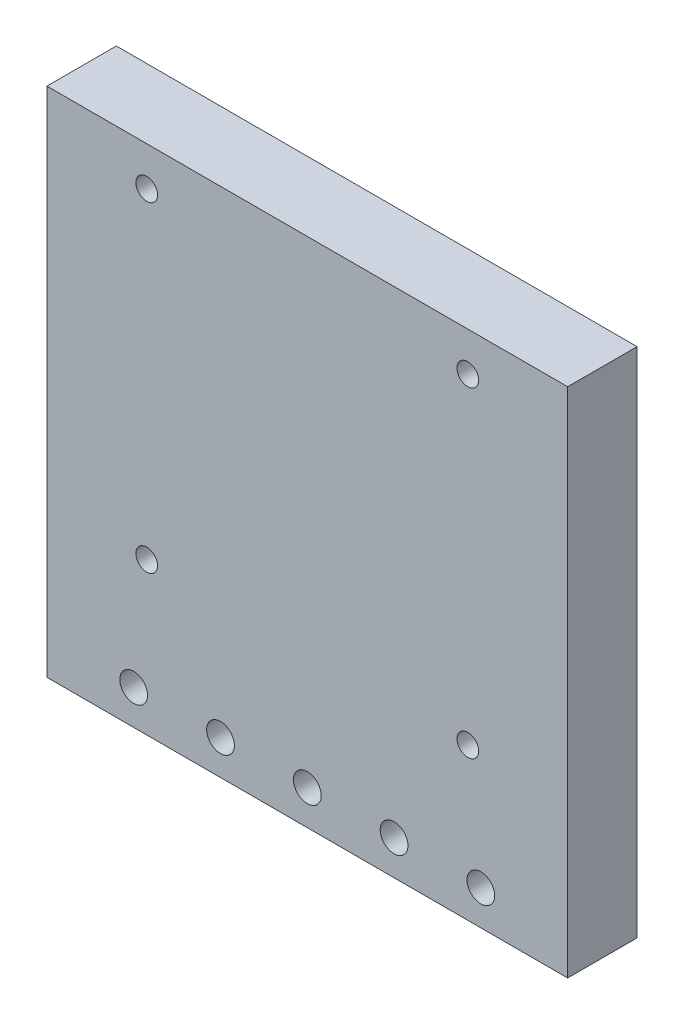
ISO-10303-21;
HEADER;
FILE_DESCRIPTION(('STEP AP214'),'2;1');
FILE_NAME('part.step','',(''),(''),'','','');
FILE_SCHEMA(('AUTOMOTIVE_DESIGN { 1 0 10303 214 1 1 1 1 }'));
ENDSEC;
DATA;
#1=APPLICATION_CONTEXT('core data for automotive mechanical design processes');
#2=APPLICATION_PROTOCOL_DEFINITION('international standard','automotive_design',2000,#1);
#3=PRODUCT_CONTEXT('',#1,'mechanical');
#4=PRODUCT('Part','Part','',(#3));
#5=PRODUCT_RELATED_PRODUCT_CATEGORY('part','',(#4));
#6=PRODUCT_DEFINITION_FORMATION('','',#4);
#7=PRODUCT_DEFINITION_CONTEXT('part definition',#1,'design');
#8=PRODUCT_DEFINITION('design','',#6,#7);
#9=PRODUCT_DEFINITION_SHAPE('','',#8);
#10=(LENGTH_UNIT() NAMED_UNIT(*) SI_UNIT(.MILLI.,.METRE.));
#11=(NAMED_UNIT(*) PLANE_ANGLE_UNIT() SI_UNIT($,.RADIAN.));
#12=(NAMED_UNIT(*) SI_UNIT($,.STERADIAN.) SOLID_ANGLE_UNIT());
#13=UNCERTAINTY_MEASURE_WITH_UNIT(LENGTH_MEASURE(1.E-05),#10,'distance_accuracy_value','');
#14=(GEOMETRIC_REPRESENTATION_CONTEXT(3) GLOBAL_UNCERTAINTY_ASSIGNED_CONTEXT((#13)) GLOBAL_UNIT_ASSIGNED_CONTEXT((#10,
#11,#12)) REPRESENTATION_CONTEXT('',''));
#15=CARTESIAN_POINT('',(0.,0.,0.));
#16=DIRECTION('',(0.,0.,1.));
#17=DIRECTION('',(1.,0.,0.));
#18=AXIS2_PLACEMENT_3D('',#15,#16,#17);
#19=CARTESIAN_POINT('',(0.,0.,8.));
#20=DIRECTION('',(1.,0.,0.));
#21=DIRECTION('',(0.,1.,0.));
#22=AXIS2_PLACEMENT_3D('',#19,#20,#21);
#23=PLANE('',#22);
#24=DIRECTION('',(0.,-1.,0.));
#25=VECTOR('',#24,1.);
#26=CARTESIAN_POINT('',(0.,0.,0.));
#27=LINE('',#26,#25);
#28=CARTESIAN_POINT('',(0.,0.,0.));
#29=VERTEX_POINT('',#28);
#30=CARTESIAN_POINT('',(0.,-59.,0.));
#31=VERTEX_POINT('',#30);
#32=EDGE_CURVE('E104',#29,#31,#27,.T.);
#33=ORIENTED_EDGE('',*,*,#32,.T.);
#34=DIRECTION('',(0.,0.,-1.));
#35=VECTOR('',#34,1.);
#36=CARTESIAN_POINT('',(0.,-59.,8.));
#37=LINE('',#36,#35);
#38=CARTESIAN_POINT('',(0.,-59.,8.));
#39=VERTEX_POINT('',#38);
#40=EDGE_CURVE('E11',#39,#31,#37,.T.);
#41=ORIENTED_EDGE('',*,*,#40,.F.);
#42=DIRECTION('',(0.,-1.,0.));
#43=VECTOR('',#42,1.);
#44=CARTESIAN_POINT('',(0.,0.,8.));
#45=LINE('',#44,#43);
#46=CARTESIAN_POINT('',(0.,0.,8.));
#47=VERTEX_POINT('',#46);
#48=EDGE_CURVE('E92',#47,#39,#45,.T.);
#49=ORIENTED_EDGE('',*,*,#48,.F.);
#50=DIRECTION('',(0.,0.,-1.));
#51=VECTOR('',#50,1.);
#52=CARTESIAN_POINT('',(0.,0.,8.));
#53=LINE('',#52,#51);
#54=EDGE_CURVE('E100',#47,#29,#53,.T.);
#55=ORIENTED_EDGE('',*,*,#54,.T.);
#56=EDGE_LOOP('',(#33,#41,#49,#55));
#57=FACE_BOUND('',#56,.T.);
#58=ADVANCED_FACE('F41',(#57),#23,.F.);
#59=CARTESIAN_POINT('',(0.,-59.,8.));
#60=DIRECTION('',(0.,1.,0.));
#61=DIRECTION('',(0.,0.,1.));
#62=AXIS2_PLACEMENT_3D('',#59,#60,#61);
#63=PLANE('',#62);
#64=DIRECTION('',(1.,0.,0.));
#65=VECTOR('',#64,1.);
#66=CARTESIAN_POINT('',(0.,-59.,0.));
#67=LINE('',#66,#65);
#68=CARTESIAN_POINT('',(60.,-59.,0.));
#69=VERTEX_POINT('',#68);
#70=EDGE_CURVE('E96',#31,#69,#67,.T.);
#71=ORIENTED_EDGE('',*,*,#70,.T.);
#72=DIRECTION('',(0.,0.,-1.));
#73=VECTOR('',#72,1.);
#74=CARTESIAN_POINT('',(60.,-59.,8.));
#75=LINE('',#74,#73);
#76=CARTESIAN_POINT('',(60.,-59.,8.));
#77=VERTEX_POINT('',#76);
#78=EDGE_CURVE('E49',#77,#69,#75,.T.);
#79=ORIENTED_EDGE('',*,*,#78,.F.);
#80=DIRECTION('',(1.,0.,0.));
#81=VECTOR('',#80,1.);
#82=CARTESIAN_POINT('',(0.,-59.,8.));
#83=LINE('',#82,#81);
#84=EDGE_CURVE('E87',#39,#77,#83,.T.);
#85=ORIENTED_EDGE('',*,*,#84,.F.);
#86=ORIENTED_EDGE('',*,*,#40,.T.);
#87=EDGE_LOOP('',(#71,#79,#85,#86));
#88=FACE_BOUND('',#87,.T.);
#89=ADVANCED_FACE('F95',(#88),#63,.F.);
#90=CARTESIAN_POINT('',(60.,0.,8.));
#91=DIRECTION('',(-1.,0.,0.));
#92=DIRECTION('',(0.,-1.,0.));
#93=AXIS2_PLACEMENT_3D('',#90,#91,#92);
#94=PLANE('',#93);
#95=DIRECTION('',(0.,1.,0.));
#96=VECTOR('',#95,1.);
#97=CARTESIAN_POINT('',(60.,0.,0.));
#98=LINE('',#97,#96);
#99=CARTESIAN_POINT('',(60.,0.,0.));
#100=VERTEX_POINT('',#99);
#101=EDGE_CURVE('E74',#69,#100,#98,.T.);
#102=ORIENTED_EDGE('',*,*,#101,.T.);
#103=DIRECTION('',(0.,0.,-1.));
#104=VECTOR('',#103,1.);
#105=CARTESIAN_POINT('',(60.,0.,8.));
#106=LINE('',#105,#104);
#107=CARTESIAN_POINT('',(60.,0.,8.));
#108=VERTEX_POINT('',#107);
#109=EDGE_CURVE('E97',#108,#100,#106,.T.);
#110=ORIENTED_EDGE('',*,*,#109,.F.);
#111=DIRECTION('',(0.,1.,0.));
#112=VECTOR('',#111,1.);
#113=CARTESIAN_POINT('',(60.,0.,8.));
#114=LINE('',#113,#112);
#115=EDGE_CURVE('E90',#77,#108,#114,.T.);
#116=ORIENTED_EDGE('',*,*,#115,.F.);
#117=ORIENTED_EDGE('',*,*,#78,.T.);
#118=EDGE_LOOP('',(#102,#110,#116,#117));
#119=FACE_BOUND('',#118,.T.);
#120=ADVANCED_FACE('F98',(#119),#94,.F.);
#121=CARTESIAN_POINT('',(0.,0.,8.));
#122=DIRECTION('',(0.,-1.,0.));
#123=DIRECTION('',(0.,0.,-1.));
#124=AXIS2_PLACEMENT_3D('',#121,#122,#123);
#125=PLANE('',#124);
#126=DIRECTION('',(-1.,0.,0.));
#127=VECTOR('',#126,1.);
#128=CARTESIAN_POINT('',(0.,0.,0.));
#129=LINE('',#128,#127);
#130=EDGE_CURVE('E80',#100,#29,#129,.T.);
#131=ORIENTED_EDGE('',*,*,#130,.T.);
#132=ORIENTED_EDGE('',*,*,#54,.F.);
#133=DIRECTION('',(-1.,0.,0.));
#134=VECTOR('',#133,1.);
#135=CARTESIAN_POINT('',(0.,0.,8.));
#136=LINE('',#135,#134);
#137=EDGE_CURVE('E57',#108,#47,#136,.T.);
#138=ORIENTED_EDGE('',*,*,#137,.F.);
#139=ORIENTED_EDGE('',*,*,#109,.T.);
#140=EDGE_LOOP('',(#131,#132,#138,#139));
#141=FACE_BOUND('',#140,.T.);
#142=ADVANCED_FACE('F112',(#141),#125,.F.);
#143=CARTESIAN_POINT('',(0.,0.,8.));
#144=DIRECTION('',(0.,0.,1.));
#145=DIRECTION('',(1.,0.,0.));
#146=AXIS2_PLACEMENT_3D('',#143,#144,#145);
#147=PLANE('',#146);
#148=CARTESIAN_POINT('',(10.,-55.,8.));
#149=DIRECTION('',(0.,0.,1.));
#150=DIRECTION('',(1.,0.,0.));
#151=AXIS2_PLACEMENT_3D('',#148,#149,#150);
#152=CIRCLE('',#151,1.6);
#153=CARTESIAN_POINT('',(11.6,-55.,8.));
#154=VERTEX_POINT('',#153);
#155=EDGE_CURVE('E166',#154,#154,#152,.T.);
#156=ORIENTED_EDGE('',*,*,#155,.F.);
#157=EDGE_LOOP('',(#156));
#158=FACE_BOUND('',#157,.T.);
#159=CARTESIAN_POINT('',(20.,-55.,8.));
#160=DIRECTION('',(0.,0.,1.));
#161=DIRECTION('',(1.,0.,0.));
#162=AXIS2_PLACEMENT_3D('',#159,#160,#161);
#163=CIRCLE('',#162,1.6);
#164=CARTESIAN_POINT('',(21.6,-55.,8.));
#165=VERTEX_POINT('',#164);
#166=EDGE_CURVE('E163',#165,#165,#163,.T.);
#167=ORIENTED_EDGE('',*,*,#166,.F.);
#168=EDGE_LOOP('',(#167));
#169=FACE_BOUND('',#168,.T.);
#170=CARTESIAN_POINT('',(30.,-55.,8.));
#171=DIRECTION('',(0.,0.,1.));
#172=DIRECTION('',(1.,0.,0.));
#173=AXIS2_PLACEMENT_3D('',#170,#171,#172);
#174=CIRCLE('',#173,1.6);
#175=CARTESIAN_POINT('',(31.6,-55.,8.));
#176=VERTEX_POINT('',#175);
#177=EDGE_CURVE('E157',#176,#176,#174,.T.);
#178=ORIENTED_EDGE('',*,*,#177,.F.);
#179=EDGE_LOOP('',(#178));
#180=FACE_BOUND('',#179,.T.);
#181=CARTESIAN_POINT('',(40.,-55.,8.));
#182=DIRECTION('',(0.,0.,1.));
#183=DIRECTION('',(1.,0.,0.));
#184=AXIS2_PLACEMENT_3D('',#181,#182,#183);
#185=CIRCLE('',#184,1.6);
#186=CARTESIAN_POINT('',(41.6,-55.,8.));
#187=VERTEX_POINT('',#186);
#188=EDGE_CURVE('E151',#187,#187,#185,.T.);
#189=ORIENTED_EDGE('',*,*,#188,.F.);
#190=EDGE_LOOP('',(#189));
#191=FACE_BOUND('',#190,.T.);
#192=CARTESIAN_POINT('',(50.,-55.,8.));
#193=DIRECTION('',(0.,0.,1.));
#194=DIRECTION('',(1.,0.,0.));
#195=AXIS2_PLACEMENT_3D('',#192,#193,#194);
#196=CIRCLE('',#195,1.6);
#197=CARTESIAN_POINT('',(51.6,-55.,8.));
#198=VERTEX_POINT('',#197);
#199=EDGE_CURVE('E145',#198,#198,#196,.T.);
#200=ORIENTED_EDGE('',*,*,#199,.F.);
#201=EDGE_LOOP('',(#200));
#202=FACE_BOUND('',#201,.T.);
#203=CARTESIAN_POINT('',(48.5,-4.5,8.));
#204=DIRECTION('',(0.,0.,1.));
#205=DIRECTION('',(1.,0.,0.));
#206=AXIS2_PLACEMENT_3D('',#203,#204,#205);
#207=CIRCLE('',#206,1.25);
#208=CARTESIAN_POINT('',(49.75,-4.5,8.));
#209=VERTEX_POINT('',#208);
#210=EDGE_CURVE('E121',#209,#209,#207,.T.);
#211=ORIENTED_EDGE('',*,*,#210,.F.);
#212=EDGE_LOOP('',(#211));
#213=FACE_BOUND('',#212,.T.);
#214=CARTESIAN_POINT('',(11.5,-41.5,8.));
#215=DIRECTION('',(0.,0.,1.));
#216=DIRECTION('',(1.,0.,0.));
#217=AXIS2_PLACEMENT_3D('',#214,#215,#216);
#218=CIRCLE('',#217,1.25);
#219=CARTESIAN_POINT('',(12.75,-41.5,8.));
#220=VERTEX_POINT('',#219);
#221=EDGE_CURVE('E127',#220,#220,#218,.T.);
#222=ORIENTED_EDGE('',*,*,#221,.F.);
#223=EDGE_LOOP('',(#222));
#224=FACE_BOUND('',#223,.T.);
#225=CARTESIAN_POINT('',(48.5,-41.5,8.));
#226=DIRECTION('',(0.,0.,1.));
#227=DIRECTION('',(1.,0.,0.));
#228=AXIS2_PLACEMENT_3D('',#225,#226,#227);
#229=CIRCLE('',#228,1.25);
#230=CARTESIAN_POINT('',(49.75,-41.5,8.));
#231=VERTEX_POINT('',#230);
#232=EDGE_CURVE('E128',#231,#231,#229,.T.);
#233=ORIENTED_EDGE('',*,*,#232,.F.);
#234=EDGE_LOOP('',(#233));
#235=FACE_BOUND('',#234,.T.);
#236=CARTESIAN_POINT('',(11.5,-4.5,8.));
#237=DIRECTION('',(0.,0.,1.));
#238=DIRECTION('',(1.,0.,0.));
#239=AXIS2_PLACEMENT_3D('',#236,#237,#238);
#240=CIRCLE('',#239,1.25);
#241=CARTESIAN_POINT('',(12.75,-4.5,8.));
#242=VERTEX_POINT('',#241);
#243=EDGE_CURVE('E118',#242,#242,#240,.T.);
#244=ORIENTED_EDGE('',*,*,#243,.F.);
#245=EDGE_LOOP('',(#244));
#246=FACE_BOUND('',#245,.T.);
#247=ORIENTED_EDGE('',*,*,#48,.T.);
#248=ORIENTED_EDGE('',*,*,#84,.T.);
#249=ORIENTED_EDGE('',*,*,#115,.T.);
#250=ORIENTED_EDGE('',*,*,#137,.T.);
#251=EDGE_LOOP('',(#247,#248,#249,#250));
#252=FACE_BOUND('',#251,.T.);
#253=ADVANCED_FACE('F88',(#158,#169,#180,#191,#202,#213,#224,#235,#246,#252),#147,.T.);
#254=CARTESIAN_POINT('',(0.,0.,0.));
#255=DIRECTION('',(0.,0.,1.));
#256=DIRECTION('',(1.,0.,0.));
#257=AXIS2_PLACEMENT_3D('',#254,#255,#256);
#258=PLANE('',#257);
#259=CARTESIAN_POINT('',(10.,-55.,0.));
#260=DIRECTION('',(0.,0.,1.));
#261=DIRECTION('',(1.,0.,0.));
#262=AXIS2_PLACEMENT_3D('',#259,#260,#261);
#263=CIRCLE('',#262,1.6);
#264=CARTESIAN_POINT('',(11.6,-55.,0.));
#265=VERTEX_POINT('',#264);
#266=EDGE_CURVE('E139',#265,#265,#263,.T.);
#267=ORIENTED_EDGE('',*,*,#266,.T.);
#268=EDGE_LOOP('',(#267));
#269=FACE_BOUND('',#268,.T.);
#270=CARTESIAN_POINT('',(20.,-55.,0.));
#271=DIRECTION('',(0.,0.,1.));
#272=DIRECTION('',(1.,0.,0.));
#273=AXIS2_PLACEMENT_3D('',#270,#271,#272);
#274=CIRCLE('',#273,1.6);
#275=CARTESIAN_POINT('',(21.6,-55.,0.));
#276=VERTEX_POINT('',#275);
#277=EDGE_CURVE('E160',#276,#276,#274,.T.);
#278=ORIENTED_EDGE('',*,*,#277,.T.);
#279=EDGE_LOOP('',(#278));
#280=FACE_BOUND('',#279,.T.);
#281=CARTESIAN_POINT('',(30.,-55.,0.));
#282=DIRECTION('',(0.,0.,1.));
#283=DIRECTION('',(1.,0.,0.));
#284=AXIS2_PLACEMENT_3D('',#281,#282,#283);
#285=CIRCLE('',#284,1.6);
#286=CARTESIAN_POINT('',(31.6,-55.,0.));
#287=VERTEX_POINT('',#286);
#288=EDGE_CURVE('E154',#287,#287,#285,.T.);
#289=ORIENTED_EDGE('',*,*,#288,.T.);
#290=EDGE_LOOP('',(#289));
#291=FACE_BOUND('',#290,.T.);
#292=CARTESIAN_POINT('',(40.,-55.,0.));
#293=DIRECTION('',(0.,0.,1.));
#294=DIRECTION('',(1.,0.,0.));
#295=AXIS2_PLACEMENT_3D('',#292,#293,#294);
#296=CIRCLE('',#295,1.6);
#297=CARTESIAN_POINT('',(41.6,-55.,0.));
#298=VERTEX_POINT('',#297);
#299=EDGE_CURVE('E148',#298,#298,#296,.T.);
#300=ORIENTED_EDGE('',*,*,#299,.T.);
#301=EDGE_LOOP('',(#300));
#302=FACE_BOUND('',#301,.T.);
#303=CARTESIAN_POINT('',(50.,-55.,0.));
#304=DIRECTION('',(0.,0.,1.));
#305=DIRECTION('',(1.,0.,0.));
#306=AXIS2_PLACEMENT_3D('',#303,#304,#305);
#307=CIRCLE('',#306,1.6);
#308=CARTESIAN_POINT('',(51.6,-55.,0.));
#309=VERTEX_POINT('',#308);
#310=EDGE_CURVE('E142',#309,#309,#307,.T.);
#311=ORIENTED_EDGE('',*,*,#310,.T.);
#312=EDGE_LOOP('',(#311));
#313=FACE_BOUND('',#312,.T.);
#314=CARTESIAN_POINT('',(48.5,-4.5,0.));
#315=DIRECTION('',(0.,0.,1.));
#316=DIRECTION('',(1.,0.,0.));
#317=AXIS2_PLACEMENT_3D('',#314,#315,#316);
#318=CIRCLE('',#317,1.25);
#319=CARTESIAN_POINT('',(49.75,-4.5,0.));
#320=VERTEX_POINT('',#319);
#321=EDGE_CURVE('E131',#320,#320,#318,.T.);
#322=ORIENTED_EDGE('',*,*,#321,.T.);
#323=EDGE_LOOP('',(#322));
#324=FACE_BOUND('',#323,.T.);
#325=CARTESIAN_POINT('',(11.5,-41.5,0.));
#326=DIRECTION('',(0.,0.,1.));
#327=DIRECTION('',(1.,0.,0.));
#328=AXIS2_PLACEMENT_3D('',#325,#326,#327);
#329=CIRCLE('',#328,1.25);
#330=CARTESIAN_POINT('',(12.75,-41.5,0.));
#331=VERTEX_POINT('',#330);
#332=EDGE_CURVE('E124',#331,#331,#329,.T.);
#333=ORIENTED_EDGE('',*,*,#332,.T.);
#334=EDGE_LOOP('',(#333));
#335=FACE_BOUND('',#334,.T.);
#336=CARTESIAN_POINT('',(48.5,-41.5,0.));
#337=DIRECTION('',(0.,0.,1.));
#338=DIRECTION('',(1.,0.,0.));
#339=AXIS2_PLACEMENT_3D('',#336,#337,#338);
#340=CIRCLE('',#339,1.25);
#341=CARTESIAN_POINT('',(49.75,-41.5,0.));
#342=VERTEX_POINT('',#341);
#343=EDGE_CURVE('E136',#342,#342,#340,.T.);
#344=ORIENTED_EDGE('',*,*,#343,.T.);
#345=EDGE_LOOP('',(#344));
#346=FACE_BOUND('',#345,.T.);
#347=CARTESIAN_POINT('',(11.5,-4.5,0.));
#348=DIRECTION('',(0.,0.,1.));
#349=DIRECTION('',(1.,0.,0.));
#350=AXIS2_PLACEMENT_3D('',#347,#348,#349);
#351=CIRCLE('',#350,1.25);
#352=CARTESIAN_POINT('',(12.75,-4.5,0.));
#353=VERTEX_POINT('',#352);
#354=EDGE_CURVE('E107',#353,#353,#351,.T.);
#355=ORIENTED_EDGE('',*,*,#354,.T.);
#356=EDGE_LOOP('',(#355));
#357=FACE_BOUND('',#356,.T.);
#358=ORIENTED_EDGE('',*,*,#32,.F.);
#359=ORIENTED_EDGE('',*,*,#130,.F.);
#360=ORIENTED_EDGE('',*,*,#101,.F.);
#361=ORIENTED_EDGE('',*,*,#70,.F.);
#362=EDGE_LOOP('',(#358,#359,#360,#361));
#363=FACE_BOUND('',#362,.T.);
#364=ADVANCED_FACE('F115',(#269,#280,#291,#302,#313,#324,#335,#346,#357,#363),#258,.F.);
#365=CARTESIAN_POINT('',(11.5,-4.5,0.));
#366=DIRECTION('',(0.,0.,1.));
#367=DIRECTION('',(1.,0.,0.));
#368=AXIS2_PLACEMENT_3D('',#365,#366,#367);
#369=CYLINDRICAL_SURFACE('',#368,1.25);
#370=ORIENTED_EDGE('',*,*,#354,.F.);
#371=EDGE_LOOP('',(#370));
#372=FACE_BOUND('',#371,.T.);
#373=ORIENTED_EDGE('',*,*,#243,.T.);
#374=EDGE_LOOP('',(#373));
#375=FACE_BOUND('',#374,.T.);
#376=ADVANCED_FACE('F200',(#372,#375),#369,.F.);
#377=CARTESIAN_POINT('',(48.5,-41.5,0.));
#378=DIRECTION('',(0.,0.,1.));
#379=DIRECTION('',(1.,0.,0.));
#380=AXIS2_PLACEMENT_3D('',#377,#378,#379);
#381=CYLINDRICAL_SURFACE('',#380,1.25);
#382=ORIENTED_EDGE('',*,*,#343,.F.);
#383=EDGE_LOOP('',(#382));
#384=FACE_BOUND('',#383,.T.);
#385=ORIENTED_EDGE('',*,*,#232,.T.);
#386=EDGE_LOOP('',(#385));
#387=FACE_BOUND('',#386,.T.);
#388=ADVANCED_FACE('F202',(#384,#387),#381,.F.);
#389=CARTESIAN_POINT('',(11.5,-41.5,0.));
#390=DIRECTION('',(0.,0.,1.));
#391=DIRECTION('',(1.,0.,0.));
#392=AXIS2_PLACEMENT_3D('',#389,#390,#391);
#393=CYLINDRICAL_SURFACE('',#392,1.25);
#394=ORIENTED_EDGE('',*,*,#332,.F.);
#395=EDGE_LOOP('',(#394));
#396=FACE_BOUND('',#395,.T.);
#397=ORIENTED_EDGE('',*,*,#221,.T.);
#398=EDGE_LOOP('',(#397));
#399=FACE_BOUND('',#398,.T.);
#400=ADVANCED_FACE('F209',(#396,#399),#393,.F.);
#401=CARTESIAN_POINT('',(48.5,-4.5,0.));
#402=DIRECTION('',(0.,0.,1.));
#403=DIRECTION('',(1.,0.,0.));
#404=AXIS2_PLACEMENT_3D('',#401,#402,#403);
#405=CYLINDRICAL_SURFACE('',#404,1.25);
#406=ORIENTED_EDGE('',*,*,#321,.F.);
#407=EDGE_LOOP('',(#406));
#408=FACE_BOUND('',#407,.T.);
#409=ORIENTED_EDGE('',*,*,#210,.T.);
#410=EDGE_LOOP('',(#409));
#411=FACE_BOUND('',#410,.T.);
#412=ADVANCED_FACE('F269',(#408,#411),#405,.F.);
#413=CARTESIAN_POINT('',(50.,-55.,0.));
#414=DIRECTION('',(0.,0.,1.));
#415=DIRECTION('',(1.,0.,0.));
#416=AXIS2_PLACEMENT_3D('',#413,#414,#415);
#417=CYLINDRICAL_SURFACE('',#416,1.6);
#418=ORIENTED_EDGE('',*,*,#310,.F.);
#419=EDGE_LOOP('',(#418));
#420=FACE_BOUND('',#419,.T.);
#421=ORIENTED_EDGE('',*,*,#199,.T.);
#422=EDGE_LOOP('',(#421));
#423=FACE_BOUND('',#422,.T.);
#424=ADVANCED_FACE('F277',(#420,#423),#417,.F.);
#425=CARTESIAN_POINT('',(40.,-55.,0.));
#426=DIRECTION('',(0.,0.,1.));
#427=DIRECTION('',(1.,0.,0.));
#428=AXIS2_PLACEMENT_3D('',#425,#426,#427);
#429=CYLINDRICAL_SURFACE('',#428,1.6);
#430=ORIENTED_EDGE('',*,*,#299,.F.);
#431=EDGE_LOOP('',(#430));
#432=FACE_BOUND('',#431,.T.);
#433=ORIENTED_EDGE('',*,*,#188,.T.);
#434=EDGE_LOOP('',(#433));
#435=FACE_BOUND('',#434,.T.);
#436=ADVANCED_FACE('F286',(#432,#435),#429,.F.);
#437=CARTESIAN_POINT('',(30.,-55.,0.));
#438=DIRECTION('',(0.,0.,1.));
#439=DIRECTION('',(1.,0.,0.));
#440=AXIS2_PLACEMENT_3D('',#437,#438,#439);
#441=CYLINDRICAL_SURFACE('',#440,1.6);
#442=ORIENTED_EDGE('',*,*,#288,.F.);
#443=EDGE_LOOP('',(#442));
#444=FACE_BOUND('',#443,.T.);
#445=ORIENTED_EDGE('',*,*,#177,.T.);
#446=EDGE_LOOP('',(#445));
#447=FACE_BOUND('',#446,.T.);
#448=ADVANCED_FACE('F295',(#444,#447),#441,.F.);
#449=CARTESIAN_POINT('',(20.,-55.,0.));
#450=DIRECTION('',(0.,0.,1.));
#451=DIRECTION('',(1.,0.,0.));
#452=AXIS2_PLACEMENT_3D('',#449,#450,#451);
#453=CYLINDRICAL_SURFACE('',#452,1.6);
#454=ORIENTED_EDGE('',*,*,#277,.F.);
#455=EDGE_LOOP('',(#454));
#456=FACE_BOUND('',#455,.T.);
#457=ORIENTED_EDGE('',*,*,#166,.T.);
#458=EDGE_LOOP('',(#457));
#459=FACE_BOUND('',#458,.T.);
#460=ADVANCED_FACE('F177',(#456,#459),#453,.F.);
#461=CARTESIAN_POINT('',(10.,-55.,0.));
#462=DIRECTION('',(0.,0.,1.));
#463=DIRECTION('',(1.,0.,0.));
#464=AXIS2_PLACEMENT_3D('',#461,#462,#463);
#465=CYLINDRICAL_SURFACE('',#464,1.6);
#466=ORIENTED_EDGE('',*,*,#266,.F.);
#467=EDGE_LOOP('',(#466));
#468=FACE_BOUND('',#467,.T.);
#469=ORIENTED_EDGE('',*,*,#155,.T.);
#470=EDGE_LOOP('',(#469));
#471=FACE_BOUND('',#470,.T.);
#472=ADVANCED_FACE('F174',(#468,#471),#465,.F.);
#473=CLOSED_SHELL('',(#58,#89,#120,#142,#253,#364,#376,#388,#400,#412,#424,#436,#448,#460,#472));
#474=MANIFOLD_SOLID_BREP('B2',#473);
#475=ADVANCED_BREP_SHAPE_REPRESENTATION('',(#18,#474),#14);
#476=SHAPE_DEFINITION_REPRESENTATION(#9,#475);
ENDSEC;
END-ISO-10303-21;
